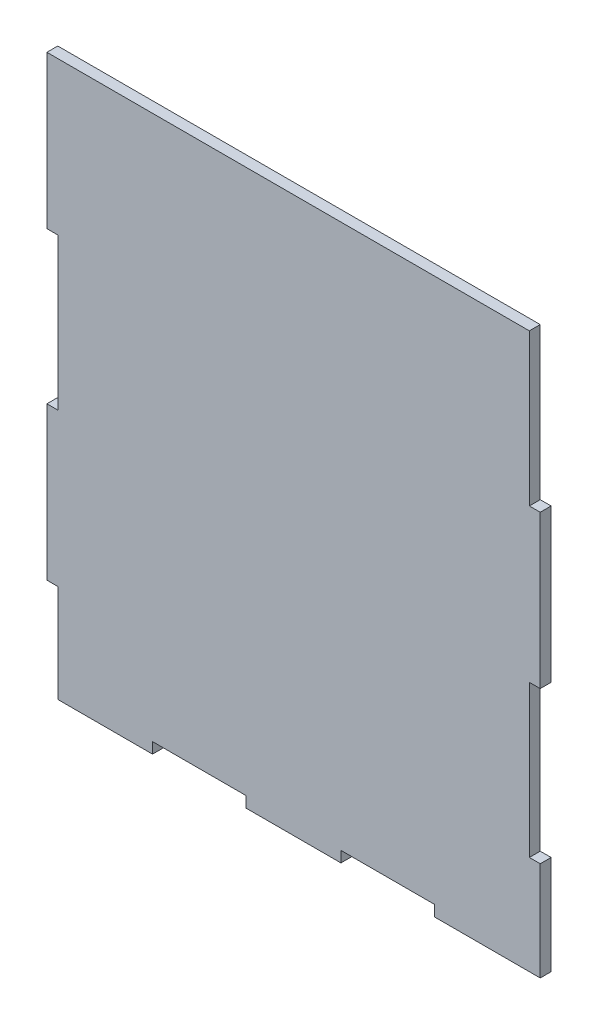
ISO-10303-21;
HEADER;
FILE_DESCRIPTION(('STEP AP214'),'2;1');
FILE_NAME('part.step','',(''),(''),'','','');
FILE_SCHEMA(('AUTOMOTIVE_DESIGN { 1 0 10303 214 1 1 1 1 }'));
ENDSEC;
DATA;
#1=APPLICATION_CONTEXT('core data for automotive mechanical design processes');
#2=APPLICATION_PROTOCOL_DEFINITION('international standard','automotive_design',2000,#1);
#3=PRODUCT_CONTEXT('',#1,'mechanical');
#4=PRODUCT('Part','Part','',(#3));
#5=PRODUCT_RELATED_PRODUCT_CATEGORY('part','',(#4));
#6=PRODUCT_DEFINITION_FORMATION('','',#4);
#7=PRODUCT_DEFINITION_CONTEXT('part definition',#1,'design');
#8=PRODUCT_DEFINITION('design','',#6,#7);
#9=PRODUCT_DEFINITION_SHAPE('','',#8);
#10=(LENGTH_UNIT() NAMED_UNIT(*) SI_UNIT(.MILLI.,.METRE.));
#11=(NAMED_UNIT(*) PLANE_ANGLE_UNIT() SI_UNIT($,.RADIAN.));
#12=(NAMED_UNIT(*) SI_UNIT($,.STERADIAN.) SOLID_ANGLE_UNIT());
#13=UNCERTAINTY_MEASURE_WITH_UNIT(LENGTH_MEASURE(1.E-05),#10,'distance_accuracy_value','');
#14=(GEOMETRIC_REPRESENTATION_CONTEXT(3) GLOBAL_UNCERTAINTY_ASSIGNED_CONTEXT((#13)) GLOBAL_UNIT_ASSIGNED_CONTEXT((#10,
#11,#12)) REPRESENTATION_CONTEXT('',''));
#15=CARTESIAN_POINT('',(0.,0.,0.));
#16=DIRECTION('',(0.,0.,1.));
#17=DIRECTION('',(1.,0.,0.));
#18=AXIS2_PLACEMENT_3D('',#15,#16,#17);
#19=CARTESIAN_POINT('',(-67.2585551330827,75.8555133079849,3.));
#20=DIRECTION('',(1.,0.,0.));
#21=DIRECTION('',(0.,1.,0.));
#22=AXIS2_PLACEMENT_3D('',#19,#20,#21);
#23=PLANE('',#22);
#24=DIRECTION('',(0.,-1.,0.));
#25=VECTOR('',#24,1.);
#26=CARTESIAN_POINT('',(-67.2585551330827,75.8555133079849,0.));
#27=LINE('',#26,#25);
#28=CARTESIAN_POINT('',(-67.2585551330827,75.8555133079849,0.));
#29=VERTEX_POINT('',#28);
#30=CARTESIAN_POINT('',(-67.2585551330826,33.7483704479846,0.));
#31=VERTEX_POINT('',#30);
#32=EDGE_CURVE('E225',#29,#31,#27,.T.);
#33=ORIENTED_EDGE('',*,*,#32,.T.);
#34=DIRECTION('',(0.,0.,-1.));
#35=VECTOR('',#34,1.);
#36=CARTESIAN_POINT('',(-67.2585551330826,33.7483704479846,3.));
#37=LINE('',#36,#35);
#38=CARTESIAN_POINT('',(-67.2585551330826,33.7483704479846,3.));
#39=VERTEX_POINT('',#38);
#40=EDGE_CURVE('E11',#39,#31,#37,.T.);
#41=ORIENTED_EDGE('',*,*,#40,.F.);
#42=DIRECTION('',(0.,-1.,0.));
#43=VECTOR('',#42,1.);
#44=CARTESIAN_POINT('',(-67.2585551330827,75.8555133079849,3.));
#45=LINE('',#44,#43);
#46=CARTESIAN_POINT('',(-67.2585551330827,75.8555133079849,3.));
#47=VERTEX_POINT('',#46);
#48=EDGE_CURVE('E272',#47,#39,#45,.T.);
#49=ORIENTED_EDGE('',*,*,#48,.F.);
#50=DIRECTION('',(0.,0.,-1.));
#51=VECTOR('',#50,1.);
#52=CARTESIAN_POINT('',(-67.2585551330827,75.8555133079849,3.));
#53=LINE('',#52,#51);
#54=EDGE_CURVE('E221',#47,#29,#53,.T.);
#55=ORIENTED_EDGE('',*,*,#54,.T.);
#56=EDGE_LOOP('',(#33,#41,#49,#55));
#57=FACE_BOUND('',#56,.T.);
#58=ADVANCED_FACE('F33',(#57),#23,.F.);
#59=CARTESIAN_POINT('',(-67.2585551330826,33.7483704479846,3.));
#60=DIRECTION('',(0.,1.,0.));
#61=DIRECTION('',(0.,0.,1.));
#62=AXIS2_PLACEMENT_3D('',#59,#60,#61);
#63=PLANE('',#62);
#64=DIRECTION('',(1.,0.,0.));
#65=VECTOR('',#64,1.);
#66=CARTESIAN_POINT('',(-67.2585551330826,33.7483704479846,0.));
#67=LINE('',#66,#65);
#68=CARTESIAN_POINT('',(-64.258555133079,33.7483704479846,0.));
#69=VERTEX_POINT('',#68);
#70=EDGE_CURVE('E228',#31,#69,#67,.T.);
#71=ORIENTED_EDGE('',*,*,#70,.T.);
#72=DIRECTION('',(0.,0.,-1.));
#73=VECTOR('',#72,1.);
#74=CARTESIAN_POINT('',(-64.258555133079,33.7483704479846,3.));
#75=LINE('',#74,#73);
#76=CARTESIAN_POINT('',(-64.258555133079,33.7483704479846,3.));
#77=VERTEX_POINT('',#76);
#78=EDGE_CURVE('E41',#77,#69,#75,.T.);
#79=ORIENTED_EDGE('',*,*,#78,.F.);
#80=DIRECTION('',(1.,0.,0.));
#81=VECTOR('',#80,1.);
#82=CARTESIAN_POINT('',(-67.2585551330826,33.7483704479846,3.));
#83=LINE('',#82,#81);
#84=EDGE_CURVE('E140',#39,#77,#83,.T.);
#85=ORIENTED_EDGE('',*,*,#84,.F.);
#86=ORIENTED_EDGE('',*,*,#40,.T.);
#87=EDGE_LOOP('',(#71,#79,#85,#86));
#88=FACE_BOUND('',#87,.T.);
#89=ADVANCED_FACE('F410',(#88),#63,.F.);
#90=CARTESIAN_POINT('',(-64.258555133079,33.7483704479846,3.));
#91=DIRECTION('',(1.,0.,0.));
#92=DIRECTION('',(0.,0.,-1.));
#93=AXIS2_PLACEMENT_3D('',#90,#91,#92);
#94=PLANE('',#93);
#95=DIRECTION('',(0.,-1.,0.));
#96=VECTOR('',#95,1.);
#97=CARTESIAN_POINT('',(-64.258555133079,33.7483704479846,0.));
#98=LINE('',#97,#96);
#99=CARTESIAN_POINT('',(-64.258555133079,-8.05877241201515,0.));
#100=VERTEX_POINT('',#99);
#101=EDGE_CURVE('E230',#69,#100,#98,.T.);
#102=ORIENTED_EDGE('',*,*,#101,.T.);
#103=DIRECTION('',(0.,0.,-1.));
#104=VECTOR('',#103,1.);
#105=CARTESIAN_POINT('',(-64.258555133079,-8.05877241201515,3.));
#106=LINE('',#105,#104);
#107=CARTESIAN_POINT('',(-64.258555133079,-8.05877241201515,3.));
#108=VERTEX_POINT('',#107);
#109=EDGE_CURVE('E327',#108,#100,#106,.T.);
#110=ORIENTED_EDGE('',*,*,#109,.F.);
#111=DIRECTION('',(0.,-1.,0.));
#112=VECTOR('',#111,1.);
#113=CARTESIAN_POINT('',(-64.258555133079,33.7483704479846,3.));
#114=LINE('',#113,#112);
#115=EDGE_CURVE('E335',#77,#108,#114,.T.);
#116=ORIENTED_EDGE('',*,*,#115,.F.);
#117=ORIENTED_EDGE('',*,*,#78,.T.);
#118=EDGE_LOOP('',(#102,#110,#116,#117));
#119=FACE_BOUND('',#118,.T.);
#120=ADVANCED_FACE('F333',(#119),#94,.F.);
#121=CARTESIAN_POINT('',(-64.258555133079,-8.05877241201515,3.));
#122=DIRECTION('',(0.,-1.,0.));
#123=DIRECTION('',(0.,0.,-1.));
#124=AXIS2_PLACEMENT_3D('',#121,#122,#123);
#125=PLANE('',#124);
#126=DIRECTION('',(-1.,0.,0.));
#127=VECTOR('',#126,1.);
#128=CARTESIAN_POINT('',(-64.258555133079,-8.05877241201515,0.));
#129=LINE('',#128,#127);
#130=CARTESIAN_POINT('',(-67.2585551330826,-8.05877241201515,0.));
#131=VERTEX_POINT('',#130);
#132=EDGE_CURVE('E232',#100,#131,#129,.T.);
#133=ORIENTED_EDGE('',*,*,#132,.T.);
#134=DIRECTION('',(0.,0.,-1.));
#135=VECTOR('',#134,1.);
#136=CARTESIAN_POINT('',(-67.2585551330826,-8.05877241201515,3.));
#137=LINE('',#136,#135);
#138=CARTESIAN_POINT('',(-67.2585551330826,-8.05877241201515,3.));
#139=VERTEX_POINT('',#138);
#140=EDGE_CURVE('E324',#139,#131,#137,.T.);
#141=ORIENTED_EDGE('',*,*,#140,.F.);
#142=DIRECTION('',(-1.,0.,0.));
#143=VECTOR('',#142,1.);
#144=CARTESIAN_POINT('',(-64.258555133079,-8.05877241201515,3.));
#145=LINE('',#144,#143);
#146=EDGE_CURVE('E353',#108,#139,#145,.T.);
#147=ORIENTED_EDGE('',*,*,#146,.F.);
#148=ORIENTED_EDGE('',*,*,#109,.T.);
#149=EDGE_LOOP('',(#133,#141,#147,#148));
#150=FACE_BOUND('',#149,.T.);
#151=ADVANCED_FACE('F344',(#150),#125,.F.);
#152=CARTESIAN_POINT('',(-67.2585551330826,-8.05877241201515,3.));
#153=DIRECTION('',(1.,0.,0.));
#154=DIRECTION('',(0.,0.,-1.));
#155=AXIS2_PLACEMENT_3D('',#152,#153,#154);
#156=PLANE('',#155);
#157=DIRECTION('',(0.,-1.,0.));
#158=VECTOR('',#157,1.);
#159=CARTESIAN_POINT('',(-67.2585551330826,-8.05877241201515,0.));
#160=LINE('',#159,#158);
#161=CARTESIAN_POINT('',(-67.2585551330826,-50.1659152720151,0.));
#162=VERTEX_POINT('',#161);
#163=EDGE_CURVE('E234',#131,#162,#160,.T.);
#164=ORIENTED_EDGE('',*,*,#163,.T.);
#165=DIRECTION('',(0.,0.,-1.));
#166=VECTOR('',#165,1.);
#167=CARTESIAN_POINT('',(-67.2585551330826,-50.1659152720151,3.));
#168=LINE('',#167,#166);
#169=CARTESIAN_POINT('',(-67.2585551330826,-50.1659152720151,3.));
#170=VERTEX_POINT('',#169);
#171=EDGE_CURVE('E321',#170,#162,#168,.T.);
#172=ORIENTED_EDGE('',*,*,#171,.F.);
#173=DIRECTION('',(0.,-1.,0.));
#174=VECTOR('',#173,1.);
#175=CARTESIAN_POINT('',(-67.2585551330826,-8.05877241201515,3.));
#176=LINE('',#175,#174);
#177=EDGE_CURVE('E350',#139,#170,#176,.T.);
#178=ORIENTED_EDGE('',*,*,#177,.F.);
#179=ORIENTED_EDGE('',*,*,#140,.T.);
#180=EDGE_LOOP('',(#164,#172,#178,#179));
#181=FACE_BOUND('',#180,.T.);
#182=ADVANCED_FACE('F348',(#181),#156,.F.);
#183=CARTESIAN_POINT('',(-67.2585551330826,-50.1659152720151,3.));
#184=DIRECTION('',(0.,1.,0.));
#185=DIRECTION('',(-1.,0.,0.));
#186=AXIS2_PLACEMENT_3D('',#183,#184,#185);
#187=PLANE('',#186);
#188=DIRECTION('',(1.,0.,0.));
#189=VECTOR('',#188,1.);
#190=CARTESIAN_POINT('',(-67.2585551330826,-50.1659152720151,0.));
#191=LINE('',#190,#189);
#192=CARTESIAN_POINT('',(-64.258555133079,-50.1659152720151,0.));
#193=VERTEX_POINT('',#192);
#194=EDGE_CURVE('E236',#162,#193,#191,.T.);
#195=ORIENTED_EDGE('',*,*,#194,.T.);
#196=DIRECTION('',(0.,0.,-1.));
#197=VECTOR('',#196,1.);
#198=CARTESIAN_POINT('',(-64.258555133079,-50.1659152720151,3.));
#199=LINE('',#198,#197);
#200=CARTESIAN_POINT('',(-64.258555133079,-50.1659152720151,3.));
#201=VERTEX_POINT('',#200);
#202=EDGE_CURVE('E318',#201,#193,#199,.T.);
#203=ORIENTED_EDGE('',*,*,#202,.F.);
#204=DIRECTION('',(1.,0.,0.));
#205=VECTOR('',#204,1.);
#206=CARTESIAN_POINT('',(-67.2585551330826,-50.1659152720151,3.));
#207=LINE('',#206,#205);
#208=EDGE_CURVE('E352',#170,#201,#207,.T.);
#209=ORIENTED_EDGE('',*,*,#208,.F.);
#210=ORIENTED_EDGE('',*,*,#171,.T.);
#211=EDGE_LOOP('',(#195,#203,#209,#210));
#212=FACE_BOUND('',#211,.T.);
#213=ADVANCED_FACE('F423',(#212),#187,.F.);
#214=CARTESIAN_POINT('',(-64.258555133079,-77.1444866920169,3.));
#215=DIRECTION('',(1.,0.,0.));
#216=DIRECTION('',(0.,0.,-1.));
#217=AXIS2_PLACEMENT_3D('',#214,#215,#216);
#218=PLANE('',#217);
#219=DIRECTION('',(0.,-1.,0.));
#220=VECTOR('',#219,1.);
#221=CARTESIAN_POINT('',(-64.258555133079,-77.1444866920169,0.));
#222=LINE('',#221,#220);
#223=CARTESIAN_POINT('',(-64.258555133079,-77.1444866920169,0.));
#224=VERTEX_POINT('',#223);
#225=EDGE_CURVE('E238',#193,#224,#222,.T.);
#226=ORIENTED_EDGE('',*,*,#225,.T.);
#227=DIRECTION('',(0.,0.,-1.));
#228=VECTOR('',#227,1.);
#229=CARTESIAN_POINT('',(-64.258555133079,-77.1444866920169,3.));
#230=LINE('',#229,#228);
#231=CARTESIAN_POINT('',(-64.258555133079,-77.1444866920169,3.));
#232=VERTEX_POINT('',#231);
#233=EDGE_CURVE('E315',#232,#224,#230,.T.);
#234=ORIENTED_EDGE('',*,*,#233,.F.);
#235=DIRECTION('',(0.,-1.,0.));
#236=VECTOR('',#235,1.);
#237=CARTESIAN_POINT('',(-64.258555133079,-77.1444866920169,3.));
#238=LINE('',#237,#236);
#239=EDGE_CURVE('E355',#201,#232,#238,.T.);
#240=ORIENTED_EDGE('',*,*,#239,.F.);
#241=ORIENTED_EDGE('',*,*,#202,.T.);
#242=EDGE_LOOP('',(#226,#234,#240,#241));
#243=FACE_BOUND('',#242,.T.);
#244=ADVANCED_FACE('F426',(#243),#218,.F.);
#245=CARTESIAN_POINT('',(-64.258555133079,-77.1444866920169,3.));
#246=DIRECTION('',(0.,1.,0.));
#247=DIRECTION('',(0.,0.,1.));
#248=AXIS2_PLACEMENT_3D('',#245,#246,#247);
#249=PLANE('',#248);
#250=DIRECTION('',(1.,0.,0.));
#251=VECTOR('',#250,1.);
#252=CARTESIAN_POINT('',(-64.258555133079,-77.1444866920169,0.));
#253=LINE('',#252,#251);
#254=CARTESIAN_POINT('',(-38.138555133079,-77.1444866920169,0.));
#255=VERTEX_POINT('',#254);
#256=EDGE_CURVE('E240',#224,#255,#253,.T.);
#257=ORIENTED_EDGE('',*,*,#256,.T.);
#258=DIRECTION('',(0.,0.,-1.));
#259=VECTOR('',#258,1.);
#260=CARTESIAN_POINT('',(-38.138555133079,-77.1444866920169,3.));
#261=LINE('',#260,#259);
#262=CARTESIAN_POINT('',(-38.138555133079,-77.1444866920169,3.));
#263=VERTEX_POINT('',#262);
#264=EDGE_CURVE('E312',#263,#255,#261,.T.);
#265=ORIENTED_EDGE('',*,*,#264,.F.);
#266=DIRECTION('',(1.,0.,0.));
#267=VECTOR('',#266,1.);
#268=CARTESIAN_POINT('',(-64.258555133079,-77.1444866920169,3.));
#269=LINE('',#268,#267);
#270=EDGE_CURVE('E361',#232,#263,#269,.T.);
#271=ORIENTED_EDGE('',*,*,#270,.F.);
#272=ORIENTED_EDGE('',*,*,#233,.T.);
#273=EDGE_LOOP('',(#257,#265,#271,#272));
#274=FACE_BOUND('',#273,.T.);
#275=ADVANCED_FACE('F430',(#274),#249,.F.);
#276=CARTESIAN_POINT('',(-38.138555133079,-77.1444866920169,3.));
#277=DIRECTION('',(-1.,0.,0.));
#278=DIRECTION('',(0.,0.,1.));
#279=AXIS2_PLACEMENT_3D('',#276,#277,#278);
#280=PLANE('',#279);
#281=DIRECTION('',(0.,1.,0.));
#282=VECTOR('',#281,1.);
#283=CARTESIAN_POINT('',(-38.138555133079,-77.1444866920169,0.));
#284=LINE('',#283,#282);
#285=CARTESIAN_POINT('',(-38.138555133079,-74.1444866920133,0.));
#286=VERTEX_POINT('',#285);
#287=EDGE_CURVE('E242',#255,#286,#284,.T.);
#288=ORIENTED_EDGE('',*,*,#287,.T.);
#289=DIRECTION('',(0.,0.,-1.));
#290=VECTOR('',#289,1.);
#291=CARTESIAN_POINT('',(-38.138555133079,-74.1444866920133,3.));
#292=LINE('',#291,#290);
#293=CARTESIAN_POINT('',(-38.138555133079,-74.1444866920133,3.));
#294=VERTEX_POINT('',#293);
#295=EDGE_CURVE('E309',#294,#286,#292,.T.);
#296=ORIENTED_EDGE('',*,*,#295,.F.);
#297=DIRECTION('',(0.,1.,0.));
#298=VECTOR('',#297,1.);
#299=CARTESIAN_POINT('',(-38.138555133079,-77.1444866920169,3.));
#300=LINE('',#299,#298);
#301=EDGE_CURVE('E363',#263,#294,#300,.T.);
#302=ORIENTED_EDGE('',*,*,#301,.F.);
#303=ORIENTED_EDGE('',*,*,#264,.T.);
#304=EDGE_LOOP('',(#288,#296,#302,#303));
#305=FACE_BOUND('',#304,.T.);
#306=ADVANCED_FACE('F434',(#305),#280,.F.);
#307=CARTESIAN_POINT('',(-38.138555133079,-74.1444866920133,3.));
#308=DIRECTION('',(0.,1.,0.));
#309=DIRECTION('',(-1.,0.,0.));
#310=AXIS2_PLACEMENT_3D('',#307,#308,#309);
#311=PLANE('',#310);
#312=DIRECTION('',(1.,0.,0.));
#313=VECTOR('',#312,1.);
#314=CARTESIAN_POINT('',(-38.138555133079,-74.1444866920133,0.));
#315=LINE('',#314,#313);
#316=CARTESIAN_POINT('',(-12.318555133079,-74.1444866920133,0.));
#317=VERTEX_POINT('',#316);
#318=EDGE_CURVE('E244',#286,#317,#315,.T.);
#319=ORIENTED_EDGE('',*,*,#318,.T.);
#320=DIRECTION('',(0.,0.,-1.));
#321=VECTOR('',#320,1.);
#322=CARTESIAN_POINT('',(-12.318555133079,-74.1444866920133,3.));
#323=LINE('',#322,#321);
#324=CARTESIAN_POINT('',(-12.318555133079,-74.1444866920133,3.));
#325=VERTEX_POINT('',#324);
#326=EDGE_CURVE('E306',#325,#317,#323,.T.);
#327=ORIENTED_EDGE('',*,*,#326,.F.);
#328=DIRECTION('',(1.,0.,0.));
#329=VECTOR('',#328,1.);
#330=CARTESIAN_POINT('',(-38.138555133079,-74.1444866920133,3.));
#331=LINE('',#330,#329);
#332=EDGE_CURVE('E365',#294,#325,#331,.T.);
#333=ORIENTED_EDGE('',*,*,#332,.F.);
#334=ORIENTED_EDGE('',*,*,#295,.T.);
#335=EDGE_LOOP('',(#319,#327,#333,#334));
#336=FACE_BOUND('',#335,.T.);
#337=ADVANCED_FACE('F438',(#336),#311,.F.);
#338=CARTESIAN_POINT('',(-12.318555133079,-74.1444866920133,3.));
#339=DIRECTION('',(1.,0.,0.));
#340=DIRECTION('',(0.,1.,0.));
#341=AXIS2_PLACEMENT_3D('',#338,#339,#340);
#342=PLANE('',#341);
#343=DIRECTION('',(0.,-1.,0.));
#344=VECTOR('',#343,1.);
#345=CARTESIAN_POINT('',(-12.318555133079,-74.1444866920133,0.));
#346=LINE('',#345,#344);
#347=CARTESIAN_POINT('',(-12.318555133079,-77.1444866920169,0.));
#348=VERTEX_POINT('',#347);
#349=EDGE_CURVE('E246',#317,#348,#346,.T.);
#350=ORIENTED_EDGE('',*,*,#349,.T.);
#351=DIRECTION('',(0.,0.,-1.));
#352=VECTOR('',#351,1.);
#353=CARTESIAN_POINT('',(-12.318555133079,-77.1444866920169,3.));
#354=LINE('',#353,#352);
#355=CARTESIAN_POINT('',(-12.318555133079,-77.1444866920169,3.));
#356=VERTEX_POINT('',#355);
#357=EDGE_CURVE('E303',#356,#348,#354,.T.);
#358=ORIENTED_EDGE('',*,*,#357,.F.);
#359=DIRECTION('',(0.,-1.,0.));
#360=VECTOR('',#359,1.);
#361=CARTESIAN_POINT('',(-12.318555133079,-74.1444866920133,3.));
#362=LINE('',#361,#360);
#363=EDGE_CURVE('E367',#325,#356,#362,.T.);
#364=ORIENTED_EDGE('',*,*,#363,.F.);
#365=ORIENTED_EDGE('',*,*,#326,.T.);
#366=EDGE_LOOP('',(#350,#358,#364,#365));
#367=FACE_BOUND('',#366,.T.);
#368=ADVANCED_FACE('F442',(#367),#342,.F.);
#369=CARTESIAN_POINT('',(-12.318555133079,-77.1444866920169,3.));
#370=DIRECTION('',(0.,1.,0.));
#371=DIRECTION('',(0.,0.,1.));
#372=AXIS2_PLACEMENT_3D('',#369,#370,#371);
#373=PLANE('',#372);
#374=DIRECTION('',(1.,0.,0.));
#375=VECTOR('',#374,1.);
#376=CARTESIAN_POINT('',(-12.318555133079,-77.1444866920169,0.));
#377=LINE('',#376,#375);
#378=CARTESIAN_POINT('',(13.801444866921,-77.1444866920169,0.));
#379=VERTEX_POINT('',#378);
#380=EDGE_CURVE('E248',#348,#379,#377,.T.);
#381=ORIENTED_EDGE('',*,*,#380,.T.);
#382=DIRECTION('',(0.,0.,-1.));
#383=VECTOR('',#382,1.);
#384=CARTESIAN_POINT('',(13.801444866921,-77.1444866920169,3.));
#385=LINE('',#384,#383);
#386=CARTESIAN_POINT('',(13.801444866921,-77.1444866920169,3.));
#387=VERTEX_POINT('',#386);
#388=EDGE_CURVE('E300',#387,#379,#385,.T.);
#389=ORIENTED_EDGE('',*,*,#388,.F.);
#390=DIRECTION('',(1.,0.,0.));
#391=VECTOR('',#390,1.);
#392=CARTESIAN_POINT('',(-12.318555133079,-77.1444866920169,3.));
#393=LINE('',#392,#391);
#394=EDGE_CURVE('E369',#356,#387,#393,.T.);
#395=ORIENTED_EDGE('',*,*,#394,.F.);
#396=ORIENTED_EDGE('',*,*,#357,.T.);
#397=EDGE_LOOP('',(#381,#389,#395,#396));
#398=FACE_BOUND('',#397,.T.);
#399=ADVANCED_FACE('F446',(#398),#373,.F.);
#400=CARTESIAN_POINT('',(13.801444866921,-77.1444866920169,3.));
#401=DIRECTION('',(-1.,0.,0.));
#402=DIRECTION('',(0.,-1.,0.));
#403=AXIS2_PLACEMENT_3D('',#400,#401,#402);
#404=PLANE('',#403);
#405=DIRECTION('',(0.,1.,0.));
#406=VECTOR('',#405,1.);
#407=CARTESIAN_POINT('',(13.801444866921,-77.1444866920169,0.));
#408=LINE('',#407,#406);
#409=CARTESIAN_POINT('',(13.8014448669211,-74.1444866920133,0.));
#410=VERTEX_POINT('',#409);
#411=EDGE_CURVE('E250',#379,#410,#408,.T.);
#412=ORIENTED_EDGE('',*,*,#411,.T.);
#413=DIRECTION('',(0.,0.,-1.));
#414=VECTOR('',#413,1.);
#415=CARTESIAN_POINT('',(13.8014448669211,-74.1444866920133,3.));
#416=LINE('',#415,#414);
#417=CARTESIAN_POINT('',(13.8014448669211,-74.1444866920133,3.));
#418=VERTEX_POINT('',#417);
#419=EDGE_CURVE('E297',#418,#410,#416,.T.);
#420=ORIENTED_EDGE('',*,*,#419,.F.);
#421=DIRECTION('',(0.,1.,0.));
#422=VECTOR('',#421,1.);
#423=CARTESIAN_POINT('',(13.801444866921,-77.1444866920169,3.));
#424=LINE('',#423,#422);
#425=EDGE_CURVE('E371',#387,#418,#424,.T.);
#426=ORIENTED_EDGE('',*,*,#425,.F.);
#427=ORIENTED_EDGE('',*,*,#388,.T.);
#428=EDGE_LOOP('',(#412,#420,#426,#427));
#429=FACE_BOUND('',#428,.T.);
#430=ADVANCED_FACE('F450',(#429),#404,.F.);
#431=CARTESIAN_POINT('',(13.8014448669211,-74.1444866920133,3.));
#432=DIRECTION('',(0.,1.,0.));
#433=DIRECTION('',(0.,0.,1.));
#434=AXIS2_PLACEMENT_3D('',#431,#432,#433);
#435=PLANE('',#434);
#436=DIRECTION('',(1.,0.,0.));
#437=VECTOR('',#436,1.);
#438=CARTESIAN_POINT('',(13.8014448669211,-74.1444866920133,0.));
#439=LINE('',#438,#437);
#440=CARTESIAN_POINT('',(39.6214448669211,-74.1444866920133,0.));
#441=VERTEX_POINT('',#440);
#442=EDGE_CURVE('E252',#410,#441,#439,.T.);
#443=ORIENTED_EDGE('',*,*,#442,.T.);
#444=DIRECTION('',(0.,0.,-1.));
#445=VECTOR('',#444,1.);
#446=CARTESIAN_POINT('',(39.6214448669211,-74.1444866920133,3.));
#447=LINE('',#446,#445);
#448=CARTESIAN_POINT('',(39.6214448669211,-74.1444866920133,3.));
#449=VERTEX_POINT('',#448);
#450=EDGE_CURVE('E294',#449,#441,#447,.T.);
#451=ORIENTED_EDGE('',*,*,#450,.F.);
#452=DIRECTION('',(1.,0.,0.));
#453=VECTOR('',#452,1.);
#454=CARTESIAN_POINT('',(13.8014448669211,-74.1444866920133,3.));
#455=LINE('',#454,#453);
#456=EDGE_CURVE('E373',#418,#449,#455,.T.);
#457=ORIENTED_EDGE('',*,*,#456,.F.);
#458=ORIENTED_EDGE('',*,*,#419,.T.);
#459=EDGE_LOOP('',(#443,#451,#457,#458));
#460=FACE_BOUND('',#459,.T.);
#461=ADVANCED_FACE('F454',(#460),#435,.F.);
#462=CARTESIAN_POINT('',(39.6214448669211,-74.1444866920133,3.));
#463=DIRECTION('',(1.,0.,0.));
#464=DIRECTION('',(0.,0.,-1.));
#465=AXIS2_PLACEMENT_3D('',#462,#463,#464);
#466=PLANE('',#465);
#467=DIRECTION('',(0.,-1.,0.));
#468=VECTOR('',#467,1.);
#469=CARTESIAN_POINT('',(39.6214448669211,-74.1444866920133,0.));
#470=LINE('',#469,#468);
#471=CARTESIAN_POINT('',(39.6214448669211,-77.1444866920169,0.));
#472=VERTEX_POINT('',#471);
#473=EDGE_CURVE('E254',#441,#472,#470,.T.);
#474=ORIENTED_EDGE('',*,*,#473,.T.);
#475=DIRECTION('',(0.,0.,-1.));
#476=VECTOR('',#475,1.);
#477=CARTESIAN_POINT('',(39.6214448669211,-77.1444866920169,3.));
#478=LINE('',#477,#476);
#479=CARTESIAN_POINT('',(39.6214448669211,-77.1444866920169,3.));
#480=VERTEX_POINT('',#479);
#481=EDGE_CURVE('E291',#480,#472,#478,.T.);
#482=ORIENTED_EDGE('',*,*,#481,.F.);
#483=DIRECTION('',(0.,-1.,0.));
#484=VECTOR('',#483,1.);
#485=CARTESIAN_POINT('',(39.6214448669211,-74.1444866920133,3.));
#486=LINE('',#485,#484);
#487=EDGE_CURVE('E375',#449,#480,#486,.T.);
#488=ORIENTED_EDGE('',*,*,#487,.F.);
#489=ORIENTED_EDGE('',*,*,#450,.T.);
#490=EDGE_LOOP('',(#474,#482,#488,#489));
#491=FACE_BOUND('',#490,.T.);
#492=ADVANCED_FACE('F458',(#491),#466,.F.);
#493=CARTESIAN_POINT('',(68.7414448669247,-77.1444866920169,3.));
#494=DIRECTION('',(0.,1.,0.));
#495=DIRECTION('',(0.,0.,1.));
#496=AXIS2_PLACEMENT_3D('',#493,#494,#495);
#497=PLANE('',#496);
#498=DIRECTION('',(1.,0.,0.));
#499=VECTOR('',#498,1.);
#500=CARTESIAN_POINT('',(68.7414448669247,-77.1444866920169,0.));
#501=LINE('',#500,#499);
#502=CARTESIAN_POINT('',(68.7414448669247,-77.1444866920169,0.));
#503=VERTEX_POINT('',#502);
#504=EDGE_CURVE('E257',#472,#503,#501,.T.);
#505=ORIENTED_EDGE('',*,*,#504,.T.);
#506=DIRECTION('',(0.,0.,-1.));
#507=VECTOR('',#506,1.);
#508=CARTESIAN_POINT('',(68.7414448669247,-77.1444866920169,3.));
#509=LINE('',#508,#507);
#510=CARTESIAN_POINT('',(68.7414448669247,-77.1444866920169,3.));
#511=VERTEX_POINT('',#510);
#512=EDGE_CURVE('E288',#511,#503,#509,.T.);
#513=ORIENTED_EDGE('',*,*,#512,.F.);
#514=DIRECTION('',(1.,0.,0.));
#515=VECTOR('',#514,1.);
#516=CARTESIAN_POINT('',(65.741444866921,-77.1444866920169,3.));
#517=LINE('',#516,#515);
#518=EDGE_CURVE('E377',#480,#511,#517,.T.);
#519=ORIENTED_EDGE('',*,*,#518,.F.);
#520=ORIENTED_EDGE('',*,*,#481,.T.);
#521=EDGE_LOOP('',(#505,#513,#519,#520));
#522=FACE_BOUND('',#521,.T.);
#523=ADVANCED_FACE('F462',(#522),#497,.F.);
#524=CARTESIAN_POINT('',(68.7414448669247,-77.1444866920169,3.));
#525=DIRECTION('',(-1.,0.,0.));
#526=DIRECTION('',(0.,0.,1.));
#527=AXIS2_PLACEMENT_3D('',#524,#525,#526);
#528=PLANE('',#527);
#529=DIRECTION('',(0.,1.,0.));
#530=VECTOR('',#529,1.);
#531=CARTESIAN_POINT('',(68.7414448669247,-77.1444866920169,0.));
#532=LINE('',#531,#530);
#533=CARTESIAN_POINT('',(68.7414448669247,-49.8659152720152,0.));
#534=VERTEX_POINT('',#533);
#535=EDGE_CURVE('E259',#503,#534,#532,.T.);
#536=ORIENTED_EDGE('',*,*,#535,.T.);
#537=DIRECTION('',(0.,0.,-1.));
#538=VECTOR('',#537,1.);
#539=CARTESIAN_POINT('',(68.7414448669247,-49.8659152720152,3.));
#540=LINE('',#539,#538);
#541=CARTESIAN_POINT('',(68.7414448669247,-49.8659152720152,3.));
#542=VERTEX_POINT('',#541);
#543=EDGE_CURVE('E285',#542,#534,#540,.T.);
#544=ORIENTED_EDGE('',*,*,#543,.F.);
#545=DIRECTION('',(0.,1.,0.));
#546=VECTOR('',#545,1.);
#547=CARTESIAN_POINT('',(68.7414448669247,-77.1444866920169,3.));
#548=LINE('',#547,#546);
#549=EDGE_CURVE('E379',#511,#542,#548,.T.);
#550=ORIENTED_EDGE('',*,*,#549,.F.);
#551=ORIENTED_EDGE('',*,*,#512,.T.);
#552=EDGE_LOOP('',(#536,#544,#550,#551));
#553=FACE_BOUND('',#552,.T.);
#554=ADVANCED_FACE('F466',(#553),#528,.F.);
#555=CARTESIAN_POINT('',(65.741444866921,-49.8659152720152,3.));
#556=DIRECTION('',(0.,-1.,0.));
#557=DIRECTION('',(0.,0.,-1.));
#558=AXIS2_PLACEMENT_3D('',#555,#556,#557);
#559=PLANE('',#558);
#560=DIRECTION('',(-1.,0.,0.));
#561=VECTOR('',#560,1.);
#562=CARTESIAN_POINT('',(65.741444866921,-49.8659152720152,0.));
#563=LINE('',#562,#561);
#564=CARTESIAN_POINT('',(65.741444866921,-49.8659152720152,0.));
#565=VERTEX_POINT('',#564);
#566=EDGE_CURVE('E261',#534,#565,#563,.T.);
#567=ORIENTED_EDGE('',*,*,#566,.T.);
#568=DIRECTION('',(0.,0.,-1.));
#569=VECTOR('',#568,1.);
#570=CARTESIAN_POINT('',(65.741444866921,-49.8659152720152,3.));
#571=LINE('',#570,#569);
#572=CARTESIAN_POINT('',(65.741444866921,-49.8659152720152,3.));
#573=VERTEX_POINT('',#572);
#574=EDGE_CURVE('E282',#573,#565,#571,.T.);
#575=ORIENTED_EDGE('',*,*,#574,.F.);
#576=DIRECTION('',(-1.,0.,0.));
#577=VECTOR('',#576,1.);
#578=CARTESIAN_POINT('',(65.741444866921,-49.8659152720152,3.));
#579=LINE('',#578,#577);
#580=EDGE_CURVE('E381',#542,#573,#579,.T.);
#581=ORIENTED_EDGE('',*,*,#580,.F.);
#582=ORIENTED_EDGE('',*,*,#543,.T.);
#583=EDGE_LOOP('',(#567,#575,#581,#582));
#584=FACE_BOUND('',#583,.T.);
#585=ADVANCED_FACE('F470',(#584),#559,.F.);
#586=CARTESIAN_POINT('',(65.741444866921,-8.0587724120151,3.));
#587=DIRECTION('',(-1.,0.,0.));
#588=DIRECTION('',(0.,0.,1.));
#589=AXIS2_PLACEMENT_3D('',#586,#587,#588);
#590=PLANE('',#589);
#591=DIRECTION('',(0.,1.,0.));
#592=VECTOR('',#591,1.);
#593=CARTESIAN_POINT('',(65.741444866921,-8.0587724120151,0.));
#594=LINE('',#593,#592);
#595=CARTESIAN_POINT('',(65.741444866921,-8.0587724120151,0.));
#596=VERTEX_POINT('',#595);
#597=EDGE_CURVE('E263',#565,#596,#594,.T.);
#598=ORIENTED_EDGE('',*,*,#597,.T.);
#599=DIRECTION('',(0.,0.,-1.));
#600=VECTOR('',#599,1.);
#601=CARTESIAN_POINT('',(65.741444866921,-8.0587724120151,3.));
#602=LINE('',#601,#600);
#603=CARTESIAN_POINT('',(65.741444866921,-8.0587724120151,3.));
#604=VERTEX_POINT('',#603);
#605=EDGE_CURVE('E279',#604,#596,#602,.T.);
#606=ORIENTED_EDGE('',*,*,#605,.F.);
#607=DIRECTION('',(0.,1.,0.));
#608=VECTOR('',#607,1.);
#609=CARTESIAN_POINT('',(65.741444866921,-8.0587724120151,3.));
#610=LINE('',#609,#608);
#611=EDGE_CURVE('E383',#573,#604,#610,.T.);
#612=ORIENTED_EDGE('',*,*,#611,.F.);
#613=ORIENTED_EDGE('',*,*,#574,.T.);
#614=EDGE_LOOP('',(#598,#606,#612,#613));
#615=FACE_BOUND('',#614,.T.);
#616=ADVANCED_FACE('F474',(#615),#590,.F.);
#617=CARTESIAN_POINT('',(68.7414448669247,-8.0587724120151,3.));
#618=DIRECTION('',(0.,1.,0.));
#619=DIRECTION('',(-1.,0.,0.));
#620=AXIS2_PLACEMENT_3D('',#617,#618,#619);
#621=PLANE('',#620);
#622=DIRECTION('',(1.,0.,0.));
#623=VECTOR('',#622,1.);
#624=CARTESIAN_POINT('',(68.7414448669247,-8.0587724120151,0.));
#625=LINE('',#624,#623);
#626=CARTESIAN_POINT('',(68.7414448669247,-8.0587724120151,0.));
#627=VERTEX_POINT('',#626);
#628=EDGE_CURVE('E265',#596,#627,#625,.T.);
#629=ORIENTED_EDGE('',*,*,#628,.T.);
#630=DIRECTION('',(0.,0.,-1.));
#631=VECTOR('',#630,1.);
#632=CARTESIAN_POINT('',(68.7414448669247,-8.0587724120151,3.));
#633=LINE('',#632,#631);
#634=CARTESIAN_POINT('',(68.7414448669247,-8.0587724120151,3.));
#635=VERTEX_POINT('',#634);
#636=EDGE_CURVE('E276',#635,#627,#633,.T.);
#637=ORIENTED_EDGE('',*,*,#636,.F.);
#638=DIRECTION('',(1.,0.,0.));
#639=VECTOR('',#638,1.);
#640=CARTESIAN_POINT('',(68.7414448669247,-8.0587724120151,3.));
#641=LINE('',#640,#639);
#642=EDGE_CURVE('E385',#604,#635,#641,.T.);
#643=ORIENTED_EDGE('',*,*,#642,.F.);
#644=ORIENTED_EDGE('',*,*,#605,.T.);
#645=EDGE_LOOP('',(#629,#637,#643,#644));
#646=FACE_BOUND('',#645,.T.);
#647=ADVANCED_FACE('F391',(#646),#621,.F.);
#648=CARTESIAN_POINT('',(68.7414448669247,34.0483704479849,3.));
#649=DIRECTION('',(-1.,0.,0.));
#650=DIRECTION('',(0.,-1.,0.));
#651=AXIS2_PLACEMENT_3D('',#648,#649,#650);
#652=PLANE('',#651);
#653=DIRECTION('',(0.,1.,0.));
#654=VECTOR('',#653,1.);
#655=CARTESIAN_POINT('',(68.7414448669247,34.0483704479849,0.));
#656=LINE('',#655,#654);
#657=CARTESIAN_POINT('',(68.7414448669247,34.0483704479849,0.));
#658=VERTEX_POINT('',#657);
#659=EDGE_CURVE('E267',#627,#658,#656,.T.);
#660=ORIENTED_EDGE('',*,*,#659,.T.);
#661=DIRECTION('',(0.,0.,-1.));
#662=VECTOR('',#661,1.);
#663=CARTESIAN_POINT('',(68.7414448669247,34.0483704479849,3.));
#664=LINE('',#663,#662);
#665=CARTESIAN_POINT('',(68.7414448669247,34.0483704479849,3.));
#666=VERTEX_POINT('',#665);
#667=EDGE_CURVE('E216',#666,#658,#664,.T.);
#668=ORIENTED_EDGE('',*,*,#667,.F.);
#669=DIRECTION('',(0.,1.,0.));
#670=VECTOR('',#669,1.);
#671=CARTESIAN_POINT('',(68.7414448669247,34.0483704479849,3.));
#672=LINE('',#671,#670);
#673=EDGE_CURVE('E207',#635,#666,#672,.T.);
#674=ORIENTED_EDGE('',*,*,#673,.F.);
#675=ORIENTED_EDGE('',*,*,#636,.T.);
#676=EDGE_LOOP('',(#660,#668,#674,#675));
#677=FACE_BOUND('',#676,.T.);
#678=ADVANCED_FACE('F395',(#677),#652,.F.);
#679=CARTESIAN_POINT('',(65.741444866921,34.0483704479849,3.));
#680=DIRECTION('',(0.,-1.,0.));
#681=DIRECTION('',(0.,0.,-1.));
#682=AXIS2_PLACEMENT_3D('',#679,#680,#681);
#683=PLANE('',#682);
#684=DIRECTION('',(-1.,0.,0.));
#685=VECTOR('',#684,1.);
#686=CARTESIAN_POINT('',(65.741444866921,34.0483704479849,0.));
#687=LINE('',#686,#685);
#688=CARTESIAN_POINT('',(65.741444866921,34.0483704479849,0.));
#689=VERTEX_POINT('',#688);
#690=EDGE_CURVE('E215',#658,#689,#687,.T.);
#691=ORIENTED_EDGE('',*,*,#690,.T.);
#692=DIRECTION('',(0.,0.,-1.));
#693=VECTOR('',#692,1.);
#694=CARTESIAN_POINT('',(65.741444866921,34.0483704479849,3.));
#695=LINE('',#694,#693);
#696=CARTESIAN_POINT('',(65.741444866921,34.0483704479849,3.));
#697=VERTEX_POINT('',#696);
#698=EDGE_CURVE('E212',#697,#689,#695,.T.);
#699=ORIENTED_EDGE('',*,*,#698,.F.);
#700=DIRECTION('',(-1.,0.,0.));
#701=VECTOR('',#700,1.);
#702=CARTESIAN_POINT('',(65.741444866921,34.0483704479849,3.));
#703=LINE('',#702,#701);
#704=EDGE_CURVE('E201',#666,#697,#703,.T.);
#705=ORIENTED_EDGE('',*,*,#704,.F.);
#706=ORIENTED_EDGE('',*,*,#667,.T.);
#707=EDGE_LOOP('',(#691,#699,#705,#706));
#708=FACE_BOUND('',#707,.T.);
#709=ADVANCED_FACE('F213',(#708),#683,.F.);
#710=CARTESIAN_POINT('',(65.741444866921,75.8555133079849,3.));
#711=DIRECTION('',(-1.,0.,0.));
#712=DIRECTION('',(0.,0.,1.));
#713=AXIS2_PLACEMENT_3D('',#710,#711,#712);
#714=PLANE('',#713);
#715=DIRECTION('',(0.,1.,0.));
#716=VECTOR('',#715,1.);
#717=CARTESIAN_POINT('',(65.741444866921,75.8555133079849,0.));
#718=LINE('',#717,#716);
#719=CARTESIAN_POINT('',(65.741444866921,75.8555133079849,0.));
#720=VERTEX_POINT('',#719);
#721=EDGE_CURVE('E126',#689,#720,#718,.T.);
#722=ORIENTED_EDGE('',*,*,#721,.T.);
#723=DIRECTION('',(0.,0.,-1.));
#724=VECTOR('',#723,1.);
#725=CARTESIAN_POINT('',(65.741444866921,75.8555133079849,3.));
#726=LINE('',#725,#724);
#727=CARTESIAN_POINT('',(65.741444866921,75.8555133079849,3.));
#728=VERTEX_POINT('',#727);
#729=EDGE_CURVE('E217',#728,#720,#726,.T.);
#730=ORIENTED_EDGE('',*,*,#729,.F.);
#731=DIRECTION('',(0.,1.,0.));
#732=VECTOR('',#731,1.);
#733=CARTESIAN_POINT('',(65.741444866921,75.8555133079849,3.));
#734=LINE('',#733,#732);
#735=EDGE_CURVE('E205',#697,#728,#734,.T.);
#736=ORIENTED_EDGE('',*,*,#735,.F.);
#737=ORIENTED_EDGE('',*,*,#698,.T.);
#738=EDGE_LOOP('',(#722,#730,#736,#737));
#739=FACE_BOUND('',#738,.T.);
#740=ADVANCED_FACE('F219',(#739),#714,.F.);
#741=CARTESIAN_POINT('',(65.741444866921,75.8555133079849,3.));
#742=DIRECTION('',(0.,-1.,0.));
#743=DIRECTION('',(0.,0.,-1.));
#744=AXIS2_PLACEMENT_3D('',#741,#742,#743);
#745=PLANE('',#744);
#746=DIRECTION('',(-1.,0.,0.));
#747=VECTOR('',#746,1.);
#748=CARTESIAN_POINT('',(65.741444866921,75.8555133079849,0.));
#749=LINE('',#748,#747);
#750=EDGE_CURVE('E132',#720,#29,#749,.T.);
#751=ORIENTED_EDGE('',*,*,#750,.T.);
#752=ORIENTED_EDGE('',*,*,#54,.F.);
#753=DIRECTION('',(-1.,0.,0.));
#754=VECTOR('',#753,1.);
#755=CARTESIAN_POINT('',(65.741444866921,75.8555133079849,3.));
#756=LINE('',#755,#754);
#757=EDGE_CURVE('E49',#728,#47,#756,.T.);
#758=ORIENTED_EDGE('',*,*,#757,.F.);
#759=ORIENTED_EDGE('',*,*,#729,.T.);
#760=EDGE_LOOP('',(#751,#752,#758,#759));
#761=FACE_BOUND('',#760,.T.);
#762=ADVANCED_FACE('F399',(#761),#745,.F.);
#763=CARTESIAN_POINT('',(0.,0.,3.));
#764=DIRECTION('',(0.,0.,1.));
#765=DIRECTION('',(1.,0.,0.));
#766=AXIS2_PLACEMENT_3D('',#763,#764,#765);
#767=PLANE('',#766);
#768=ORIENTED_EDGE('',*,*,#48,.T.);
#769=ORIENTED_EDGE('',*,*,#84,.T.);
#770=ORIENTED_EDGE('',*,*,#115,.T.);
#771=ORIENTED_EDGE('',*,*,#146,.T.);
#772=ORIENTED_EDGE('',*,*,#177,.T.);
#773=ORIENTED_EDGE('',*,*,#208,.T.);
#774=ORIENTED_EDGE('',*,*,#239,.T.);
#775=ORIENTED_EDGE('',*,*,#270,.T.);
#776=ORIENTED_EDGE('',*,*,#301,.T.);
#777=ORIENTED_EDGE('',*,*,#332,.T.);
#778=ORIENTED_EDGE('',*,*,#363,.T.);
#779=ORIENTED_EDGE('',*,*,#394,.T.);
#780=ORIENTED_EDGE('',*,*,#425,.T.);
#781=ORIENTED_EDGE('',*,*,#456,.T.);
#782=ORIENTED_EDGE('',*,*,#487,.T.);
#783=ORIENTED_EDGE('',*,*,#518,.T.);
#784=ORIENTED_EDGE('',*,*,#549,.T.);
#785=ORIENTED_EDGE('',*,*,#580,.T.);
#786=ORIENTED_EDGE('',*,*,#611,.T.);
#787=ORIENTED_EDGE('',*,*,#642,.T.);
#788=ORIENTED_EDGE('',*,*,#673,.T.);
#789=ORIENTED_EDGE('',*,*,#704,.T.);
#790=ORIENTED_EDGE('',*,*,#735,.T.);
#791=ORIENTED_EDGE('',*,*,#757,.T.);
#792=EDGE_LOOP('',(#768,#769,#770,#771,#772,#773,#774,#775,#776,#777,#778,#779,#780,#781,#782,
#783,#784,#785,#786,#787,#788,#789,#790,#791));
#793=FACE_BOUND('',#792,.T.);
#794=ADVANCED_FACE('F203',(#793),#767,.T.);
#795=CARTESIAN_POINT('',(0.,0.,0.));
#796=DIRECTION('',(0.,0.,1.));
#797=DIRECTION('',(1.,0.,0.));
#798=AXIS2_PLACEMENT_3D('',#795,#796,#797);
#799=PLANE('',#798);
#800=ORIENTED_EDGE('',*,*,#32,.F.);
#801=ORIENTED_EDGE('',*,*,#750,.F.);
#802=ORIENTED_EDGE('',*,*,#721,.F.);
#803=ORIENTED_EDGE('',*,*,#690,.F.);
#804=ORIENTED_EDGE('',*,*,#659,.F.);
#805=ORIENTED_EDGE('',*,*,#628,.F.);
#806=ORIENTED_EDGE('',*,*,#597,.F.);
#807=ORIENTED_EDGE('',*,*,#566,.F.);
#808=ORIENTED_EDGE('',*,*,#535,.F.);
#809=ORIENTED_EDGE('',*,*,#504,.F.);
#810=ORIENTED_EDGE('',*,*,#473,.F.);
#811=ORIENTED_EDGE('',*,*,#442,.F.);
#812=ORIENTED_EDGE('',*,*,#411,.F.);
#813=ORIENTED_EDGE('',*,*,#380,.F.);
#814=ORIENTED_EDGE('',*,*,#349,.F.);
#815=ORIENTED_EDGE('',*,*,#318,.F.);
#816=ORIENTED_EDGE('',*,*,#287,.F.);
#817=ORIENTED_EDGE('',*,*,#256,.F.);
#818=ORIENTED_EDGE('',*,*,#225,.F.);
#819=ORIENTED_EDGE('',*,*,#194,.F.);
#820=ORIENTED_EDGE('',*,*,#163,.F.);
#821=ORIENTED_EDGE('',*,*,#132,.F.);
#822=ORIENTED_EDGE('',*,*,#101,.F.);
#823=ORIENTED_EDGE('',*,*,#70,.F.);
#824=EDGE_LOOP('',(#800,#801,#802,#803,#804,#805,#806,#807,#808,#809,#810,#811,#812,#813,#814,
#815,#816,#817,#818,#819,#820,#821,#822,#823));
#825=FACE_BOUND('',#824,.T.);
#826=ADVANCED_FACE('F339',(#825),#799,.F.);
#827=CLOSED_SHELL('',(#58,#89,#120,#151,#182,#213,#244,#275,#306,#337,#368,#399,#430,#461,#492,
#523,#554,#585,#616,#647,#678,#709,#740,#762,#794,#826));
#828=MANIFOLD_SOLID_BREP('B2',#827);
#829=ADVANCED_BREP_SHAPE_REPRESENTATION('',(#18,#828),#14);
#830=SHAPE_DEFINITION_REPRESENTATION(#9,#829);
ENDSEC;
END-ISO-10303-21;
